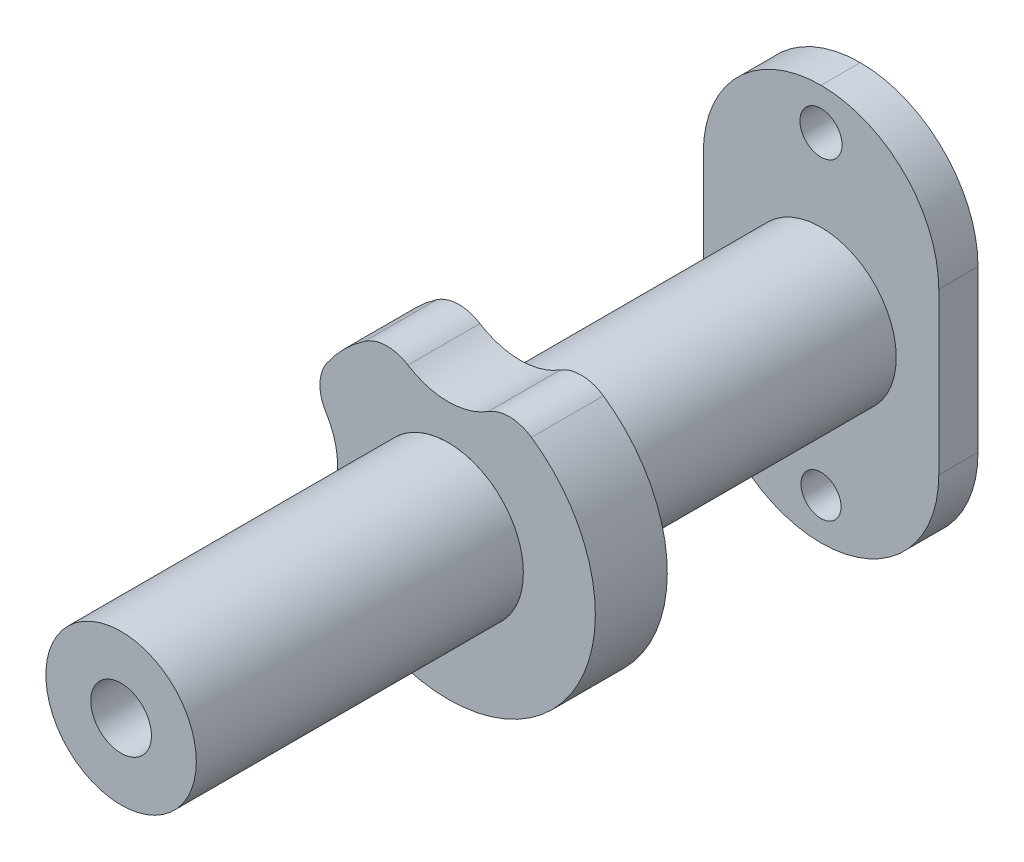
ISO-10303-21;
HEADER;
FILE_DESCRIPTION(('STEP AP214'),'2;1');
FILE_NAME('part.step','',(''),(''),'','','');
FILE_SCHEMA(('AUTOMOTIVE_DESIGN { 1 0 10303 214 1 1 1 1 }'));
ENDSEC;
DATA;
#1=APPLICATION_CONTEXT('core data for automotive mechanical design processes');
#2=APPLICATION_PROTOCOL_DEFINITION('international standard','automotive_design',2000,#1);
#3=PRODUCT_CONTEXT('',#1,'mechanical');
#4=PRODUCT('Part','Part','',(#3));
#5=PRODUCT_RELATED_PRODUCT_CATEGORY('part','',(#4));
#6=PRODUCT_DEFINITION_FORMATION('','',#4);
#7=PRODUCT_DEFINITION_CONTEXT('part definition',#1,'design');
#8=PRODUCT_DEFINITION('design','',#6,#7);
#9=PRODUCT_DEFINITION_SHAPE('','',#8);
#10=(LENGTH_UNIT() NAMED_UNIT(*) SI_UNIT(.MILLI.,.METRE.));
#11=(NAMED_UNIT(*) PLANE_ANGLE_UNIT() SI_UNIT($,.RADIAN.));
#12=(NAMED_UNIT(*) SI_UNIT($,.STERADIAN.) SOLID_ANGLE_UNIT());
#13=UNCERTAINTY_MEASURE_WITH_UNIT(LENGTH_MEASURE(1.E-05),#10,'distance_accuracy_value','');
#14=(GEOMETRIC_REPRESENTATION_CONTEXT(3) GLOBAL_UNCERTAINTY_ASSIGNED_CONTEXT((#13)) GLOBAL_UNIT_ASSIGNED_CONTEXT((#10,
#11,#12)) REPRESENTATION_CONTEXT('',''));
#15=CARTESIAN_POINT('',(0.,0.,0.));
#16=DIRECTION('',(0.,0.,1.));
#17=DIRECTION('',(1.,0.,0.));
#18=AXIS2_PLACEMENT_3D('',#15,#16,#17);
#19=CARTESIAN_POINT('',(0.,0.,43.8));
#20=DIRECTION('',(0.,0.,-1.));
#21=DIRECTION('',(-1.,0.,0.));
#22=AXIS2_PLACEMENT_3D('',#19,#20,#21);
#23=CYLINDRICAL_SURFACE('',#22,5.75);
#24=CARTESIAN_POINT('',(0.,0.,43.8));
#25=DIRECTION('',(0.,0.,1.));
#26=DIRECTION('',(1.,0.,0.));
#27=AXIS2_PLACEMENT_3D('',#24,#25,#26);
#28=CIRCLE('',#27,5.75);
#29=CARTESIAN_POINT('',(5.75,0.,43.8));
#30=VERTEX_POINT('',#29);
#31=EDGE_CURVE('E12',#30,#30,#28,.T.);
#32=ORIENTED_EDGE('',*,*,#31,.F.);
#33=EDGE_LOOP('',(#32));
#34=FACE_BOUND('',#33,.T.);
#35=CARTESIAN_POINT('',(0.,0.,18.8));
#36=DIRECTION('',(0.,0.,1.));
#37=DIRECTION('',(1.,0.,0.));
#38=AXIS2_PLACEMENT_3D('',#35,#36,#37);
#39=CIRCLE('',#38,5.75);
#40=CARTESIAN_POINT('',(5.75,0.,18.8));
#41=VERTEX_POINT('',#40);
#42=EDGE_CURVE('E63',#41,#41,#39,.T.);
#43=ORIENTED_EDGE('',*,*,#42,.T.);
#44=EDGE_LOOP('',(#43));
#45=FACE_BOUND('',#44,.T.);
#46=ADVANCED_FACE('F56',(#34,#45),#23,.T.);
#47=CARTESIAN_POINT('',(0.,0.,43.8));
#48=DIRECTION('',(0.,0.,1.));
#49=DIRECTION('',(1.,0.,0.));
#50=AXIS2_PLACEMENT_3D('',#47,#48,#49);
#51=PLANE('',#50);
#52=CARTESIAN_POINT('',(0.,0.,43.8));
#53=DIRECTION('',(0.,0.,1.));
#54=DIRECTION('',(1.,0.,0.));
#55=AXIS2_PLACEMENT_3D('',#52,#53,#54);
#56=CIRCLE('',#55,2.32);
#57=CARTESIAN_POINT('',(2.32,0.,43.8));
#58=VERTEX_POINT('',#57);
#59=EDGE_CURVE('E68',#58,#58,#56,.T.);
#60=ORIENTED_EDGE('',*,*,#59,.F.);
#61=EDGE_LOOP('',(#60));
#62=FACE_BOUND('',#61,.T.);
#63=ORIENTED_EDGE('',*,*,#31,.T.);
#64=EDGE_LOOP('',(#63));
#65=FACE_BOUND('',#64,.T.);
#66=ADVANCED_FACE('F85',(#62,#65),#51,.T.);
#67=CARTESIAN_POINT('',(0.,0.,18.8));
#68=DIRECTION('',(0.,0.,1.));
#69=DIRECTION('',(1.,0.,0.));
#70=AXIS2_PLACEMENT_3D('',#67,#68,#69);
#71=PLANE('',#70);
#72=CARTESIAN_POINT('',(0.,0.,18.8));
#73=DIRECTION('',(0.,0.,1.));
#74=DIRECTION('',(1.,0.,0.));
#75=AXIS2_PLACEMENT_3D('',#72,#73,#74);
#76=CIRCLE('',#75,2.32);
#77=CARTESIAN_POINT('',(2.32,0.,18.8));
#78=VERTEX_POINT('',#77);
#79=EDGE_CURVE('E59',#78,#78,#76,.T.);
#80=ORIENTED_EDGE('',*,*,#79,.T.);
#81=EDGE_LOOP('',(#80));
#82=FACE_BOUND('',#81,.T.);
#83=ORIENTED_EDGE('',*,*,#42,.F.);
#84=EDGE_LOOP('',(#83));
#85=FACE_BOUND('',#84,.T.);
#86=ADVANCED_FACE('F76',(#82,#85),#71,.F.);
#87=CARTESIAN_POINT('',(0.,0.,92.3));
#88=DIRECTION('',(0.,0.,-1.));
#89=DIRECTION('',(-1.,0.,0.));
#90=AXIS2_PLACEMENT_3D('',#87,#88,#89);
#91=CYLINDRICAL_SURFACE('',#90,2.32);
#92=ORIENTED_EDGE('',*,*,#59,.T.);
#93=EDGE_LOOP('',(#92));
#94=FACE_BOUND('',#93,.T.);
#95=ORIENTED_EDGE('',*,*,#79,.F.);
#96=EDGE_LOOP('',(#95));
#97=FACE_BOUND('',#96,.T.);
#98=ADVANCED_FACE('F79',(#94,#97),#91,.F.);
#99=CLOSED_SHELL('',(#46,#66,#86,#98));
#100=MANIFOLD_SOLID_BREP('B2',#99);
#101=CARTESIAN_POINT('',(0.,0.,5.5));
#102=DIRECTION('',(0.,0.,-1.));
#103=DIRECTION('',(-1.,0.,0.));
#104=AXIS2_PLACEMENT_3D('',#101,#102,#103);
#105=CYLINDRICAL_SURFACE('',#104,11.25);
#106=CARTESIAN_POINT('',(0.,0.,13.3));
#107=DIRECTION('',(0.,0.,-1.));
#108=DIRECTION('',(-1.,0.,0.));
#109=AXIS2_PLACEMENT_3D('',#106,#107,#108);
#110=CIRCLE('',#109,11.25);
#111=CARTESIAN_POINT('',(-9.27368758002561,6.3687690072791,13.3));
#112=VERTEX_POINT('',#111);
#113=CARTESIAN_POINT('',(-6.3687690072791,9.27368758002561,13.3));
#114=VERTEX_POINT('',#113);
#115=EDGE_CURVE('E341',#112,#114,#110,.T.);
#116=ORIENTED_EDGE('',*,*,#115,.F.);
#117=DIRECTION('',(0.,0.,-1.));
#118=VECTOR('',#117,1.);
#119=CARTESIAN_POINT('',(-9.27368758002561,6.3687690072791,5.5));
#120=LINE('',#119,#118);
#121=CARTESIAN_POINT('',(-9.27368758002561,6.3687690072791,18.8));
#122=VERTEX_POINT('',#121);
#123=EDGE_CURVE('E305',#112,#122,#120,.F.);
#124=ORIENTED_EDGE('',*,*,#123,.T.);
#125=CARTESIAN_POINT('',(0.,0.,18.8));
#126=DIRECTION('',(0.,0.,-1.));
#127=DIRECTION('',(-1.,0.,0.));
#128=AXIS2_PLACEMENT_3D('',#125,#126,#127);
#129=CIRCLE('',#128,11.25);
#130=CARTESIAN_POINT('',(-6.3687690072791,9.27368758002561,18.8));
#131=VERTEX_POINT('',#130);
#132=EDGE_CURVE('E333',#122,#131,#129,.T.);
#133=ORIENTED_EDGE('',*,*,#132,.T.);
#134=DIRECTION('',(0.,0.,-1.));
#135=VECTOR('',#134,1.);
#136=CARTESIAN_POINT('',(-6.3687690072791,9.27368758002561,5.5));
#137=LINE('',#136,#135);
#138=EDGE_CURVE('E303',#131,#114,#137,.T.);
#139=ORIENTED_EDGE('',*,*,#138,.T.);
#140=EDGE_LOOP('',(#116,#124,#133,#139));
#141=FACE_BOUND('',#140,.T.);
#142=ADVANCED_FACE('F117',(#141),#105,.T.);
#143=CARTESIAN_POINT('',(6.3687690072791,9.27368758002561,18.8));
#144=VERTEX_POINT('',#143);
#145=CARTESIAN_POINT('',(-9.2736875800256,-6.36876900727911,18.8));
#146=VERTEX_POINT('',#145);
#147=EDGE_CURVE('E330',#144,#146,#129,.T.);
#148=ORIENTED_EDGE('',*,*,#147,.T.);
#149=DIRECTION('',(0.,0.,-1.));
#150=VECTOR('',#149,1.);
#151=CARTESIAN_POINT('',(-9.27368758002561,-6.36876900727911,5.5));
#152=LINE('',#151,#150);
#153=CARTESIAN_POINT('',(-9.2736875800256,-6.36876900727911,13.3));
#154=VERTEX_POINT('',#153);
#155=EDGE_CURVE('E295',#146,#154,#152,.T.);
#156=ORIENTED_EDGE('',*,*,#155,.T.);
#157=CARTESIAN_POINT('',(6.3687690072791,9.27368758002561,13.3));
#158=VERTEX_POINT('',#157);
#159=EDGE_CURVE('E340',#158,#154,#110,.T.);
#160=ORIENTED_EDGE('',*,*,#159,.F.);
#161=DIRECTION('',(0.,0.,-1.));
#162=VECTOR('',#161,1.);
#163=CARTESIAN_POINT('',(6.3687690072791,9.27368758002561,5.5));
#164=LINE('',#163,#162);
#165=EDGE_CURVE('E293',#158,#144,#164,.F.);
#166=ORIENTED_EDGE('',*,*,#165,.T.);
#167=EDGE_LOOP('',(#148,#156,#160,#166));
#168=FACE_BOUND('',#167,.T.);
#169=ADVANCED_FACE('F388',(#168),#105,.T.);
#170=CARTESIAN_POINT('',(0.,0.,13.3));
#171=DIRECTION('',(0.,0.,-1.));
#172=DIRECTION('',(-1.,0.,0.));
#173=AXIS2_PLACEMENT_3D('',#170,#171,#172);
#174=PLANE('',#173);
#175=ORIENTED_EDGE('',*,*,#159,.T.);
#176=CARTESIAN_POINT('',(-6.80070422535211,-4.67043060533801,13.3));
#177=DIRECTION('',(0.,0.,-1.));
#178=DIRECTION('',(-1.,0.,0.));
#179=AXIS2_PLACEMENT_3D('',#176,#177,#178);
#180=CIRCLE('',#179,3.);
#181=CARTESIAN_POINT('',(-9.33760563380281,-3.06914011207927,13.3));
#182=VERTEX_POINT('',#181);
#183=EDGE_CURVE('E301',#154,#182,#180,.T.);
#184=ORIENTED_EDGE('',*,*,#183,.T.);
#185=CARTESIAN_POINT('',(-14.2,0.,13.3));
#186=DIRECTION('',(0.,0.,-1.));
#187=DIRECTION('',(-1.,0.,0.));
#188=AXIS2_PLACEMENT_3D('',#185,#186,#187);
#189=CIRCLE('',#188,5.75);
#190=CARTESIAN_POINT('',(-9.33760563380281,3.06914011207926,13.3));
#191=VERTEX_POINT('',#190);
#192=EDGE_CURVE('E322',#191,#182,#189,.T.);
#193=ORIENTED_EDGE('',*,*,#192,.F.);
#194=CARTESIAN_POINT('',(-6.80070422535211,4.67043060533801,13.3));
#195=DIRECTION('',(0.,0.,-1.));
#196=DIRECTION('',(-1.,0.,0.));
#197=AXIS2_PLACEMENT_3D('',#194,#195,#196);
#198=CIRCLE('',#197,3.);
#199=EDGE_CURVE('E299',#191,#112,#198,.T.);
#200=ORIENTED_EDGE('',*,*,#199,.T.);
#201=ORIENTED_EDGE('',*,*,#115,.T.);
#202=CARTESIAN_POINT('',(-4.67043060533801,6.80070422535211,13.3));
#203=DIRECTION('',(0.,0.,-1.));
#204=DIRECTION('',(-1.,0.,0.));
#205=AXIS2_PLACEMENT_3D('',#202,#203,#204);
#206=CIRCLE('',#205,3.);
#207=CARTESIAN_POINT('',(-3.06914011207926,9.33760563380281,13.3));
#208=VERTEX_POINT('',#207);
#209=EDGE_CURVE('E132',#114,#208,#206,.T.);
#210=ORIENTED_EDGE('',*,*,#209,.T.);
#211=CARTESIAN_POINT('',(0.,14.2,13.3));
#212=DIRECTION('',(0.,0.,-1.));
#213=DIRECTION('',(-1.,0.,0.));
#214=AXIS2_PLACEMENT_3D('',#211,#212,#213);
#215=CIRCLE('',#214,5.75);
#216=CARTESIAN_POINT('',(3.06914011207926,9.33760563380281,13.3));
#217=VERTEX_POINT('',#216);
#218=EDGE_CURVE('E313',#217,#208,#215,.T.);
#219=ORIENTED_EDGE('',*,*,#218,.F.);
#220=CARTESIAN_POINT('',(4.67043060533801,6.80070422535211,13.3));
#221=DIRECTION('',(0.,0.,-1.));
#222=DIRECTION('',(-1.,0.,0.));
#223=AXIS2_PLACEMENT_3D('',#220,#221,#222);
#224=CIRCLE('',#223,3.);
#225=EDGE_CURVE('E140',#217,#158,#224,.T.);
#226=ORIENTED_EDGE('',*,*,#225,.T.);
#227=EDGE_LOOP('',(#175,#184,#193,#200,#201,#210,#219,#226));
#228=FACE_BOUND('',#227,.T.);
#229=CARTESIAN_POINT('',(0.,0.,13.3));
#230=DIRECTION('',(0.,0.,-1.));
#231=DIRECTION('',(-1.,0.,0.));
#232=AXIS2_PLACEMENT_3D('',#229,#230,#231);
#233=CIRCLE('',#232,5.75);
#234=CARTESIAN_POINT('',(-5.75,0.,13.3));
#235=VERTEX_POINT('',#234);
#236=EDGE_CURVE('E337',#235,#235,#233,.T.);
#237=ORIENTED_EDGE('',*,*,#236,.F.);
#238=EDGE_LOOP('',(#237));
#239=FACE_BOUND('',#238,.T.);
#240=ADVANCED_FACE('F394',(#228,#239),#174,.T.);
#241=CARTESIAN_POINT('',(0.,0.,25.5));
#242=DIRECTION('',(0.,0.,-1.));
#243=DIRECTION('',(-1.,0.,0.));
#244=AXIS2_PLACEMENT_3D('',#241,#242,#243);
#245=CYLINDRICAL_SURFACE('',#244,2.32);
#246=CARTESIAN_POINT('',(0.,0.,-12.7));
#247=DIRECTION('',(0.,0.,-1.));
#248=DIRECTION('',(-1.,0.,0.));
#249=AXIS2_PLACEMENT_3D('',#246,#247,#248);
#250=CIRCLE('',#249,2.32);
#251=CARTESIAN_POINT('',(-2.32,0.,-12.7));
#252=VERTEX_POINT('',#251);
#253=EDGE_CURVE('E240',#252,#252,#250,.T.);
#254=ORIENTED_EDGE('',*,*,#253,.T.);
#255=EDGE_LOOP('',(#254));
#256=FACE_BOUND('',#255,.T.);
#257=CARTESIAN_POINT('',(0.,0.,18.5));
#258=DIRECTION('',(0.,0.,1.));
#259=DIRECTION('',(1.,0.,0.));
#260=AXIS2_PLACEMENT_3D('',#257,#258,#259);
#261=CIRCLE('',#260,2.32);
#262=CARTESIAN_POINT('',(2.32,0.,18.5));
#263=VERTEX_POINT('',#262);
#264=EDGE_CURVE('E343',#263,#263,#261,.T.);
#265=ORIENTED_EDGE('',*,*,#264,.T.);
#266=EDGE_LOOP('',(#265));
#267=FACE_BOUND('',#266,.T.);
#268=ADVANCED_FACE('F399',(#256,#267),#245,.F.);
#269=CARTESIAN_POINT('',(0.,0.,-12.7));
#270=DIRECTION('',(0.,0.,-1.));
#271=DIRECTION('',(-1.,0.,0.));
#272=AXIS2_PLACEMENT_3D('',#269,#270,#271);
#273=PLANE('',#272);
#274=CARTESIAN_POINT('',(0.,12.,-12.7));
#275=DIRECTION('',(0.,0.,-1.));
#276=DIRECTION('',(-1.,0.,0.));
#277=AXIS2_PLACEMENT_3D('',#274,#275,#276);
#278=CIRCLE('',#277,1.61044068265874);
#279=CARTESIAN_POINT('',(-1.61044068265874,12.,-12.7));
#280=VERTEX_POINT('',#279);
#281=EDGE_CURVE('E347',#280,#280,#278,.T.);
#282=ORIENTED_EDGE('',*,*,#281,.F.);
#283=EDGE_LOOP('',(#282));
#284=FACE_BOUND('',#283,.T.);
#285=CARTESIAN_POINT('',(0.,-12.,-12.7));
#286=DIRECTION('',(0.,0.,-1.));
#287=DIRECTION('',(-1.,0.,0.));
#288=AXIS2_PLACEMENT_3D('',#285,#286,#287);
#289=CIRCLE('',#288,1.53);
#290=CARTESIAN_POINT('',(-1.53,-12.,-12.7));
#291=VERTEX_POINT('',#290);
#292=EDGE_CURVE('E346',#291,#291,#289,.T.);
#293=ORIENTED_EDGE('',*,*,#292,.F.);
#294=EDGE_LOOP('',(#293));
#295=FACE_BOUND('',#294,.T.);
#296=ORIENTED_EDGE('',*,*,#253,.F.);
#297=EDGE_LOOP('',(#296));
#298=FACE_BOUND('',#297,.T.);
#299=DIRECTION('',(0.,-1.,0.));
#300=VECTOR('',#299,1.);
#301=CARTESIAN_POINT('',(9.,15.15,-12.7));
#302=LINE('',#301,#300);
#303=CARTESIAN_POINT('',(9.,6.15,-12.7));
#304=VERTEX_POINT('',#303);
#305=CARTESIAN_POINT('',(9.,-6.15,-12.7));
#306=VERTEX_POINT('',#305);
#307=EDGE_CURVE('E223',#304,#306,#302,.T.);
#308=ORIENTED_EDGE('',*,*,#307,.T.);
#309=CARTESIAN_POINT('',(0.,-6.15,-12.7));
#310=DIRECTION('',(0.,0.,-1.));
#311=DIRECTION('',(-1.,0.,0.));
#312=AXIS2_PLACEMENT_3D('',#309,#310,#311);
#313=CIRCLE('',#312,9.);
#314=CARTESIAN_POINT('',(0.,-15.15,-12.7));
#315=VERTEX_POINT('',#314);
#316=EDGE_CURVE('E256',#306,#315,#313,.T.);
#317=ORIENTED_EDGE('',*,*,#316,.T.);
#318=CARTESIAN_POINT('',(0.,-6.15,-12.7));
#319=DIRECTION('',(0.,0.,-1.));
#320=DIRECTION('',(-1.,0.,0.));
#321=AXIS2_PLACEMENT_3D('',#318,#319,#320);
#322=CIRCLE('',#321,9.);
#323=CARTESIAN_POINT('',(-9.,-6.15,-12.7));
#324=VERTEX_POINT('',#323);
#325=EDGE_CURVE('E254',#315,#324,#322,.T.);
#326=ORIENTED_EDGE('',*,*,#325,.T.);
#327=DIRECTION('',(0.,1.,0.));
#328=VECTOR('',#327,1.);
#329=CARTESIAN_POINT('',(-9.,15.15,-12.7));
#330=LINE('',#329,#328);
#331=CARTESIAN_POINT('',(-9.,6.15,-12.7));
#332=VERTEX_POINT('',#331);
#333=EDGE_CURVE('E239',#324,#332,#330,.T.);
#334=ORIENTED_EDGE('',*,*,#333,.T.);
#335=CARTESIAN_POINT('',(0.,6.15,-12.7));
#336=DIRECTION('',(0.,0.,-1.));
#337=DIRECTION('',(-1.,0.,0.));
#338=AXIS2_PLACEMENT_3D('',#335,#336,#337);
#339=CIRCLE('',#338,9.);
#340=CARTESIAN_POINT('',(0.,15.15,-12.7));
#341=VERTEX_POINT('',#340);
#342=EDGE_CURVE('E225',#332,#341,#339,.T.);
#343=ORIENTED_EDGE('',*,*,#342,.T.);
#344=CARTESIAN_POINT('',(0.,6.15,-12.7));
#345=DIRECTION('',(0.,0.,-1.));
#346=DIRECTION('',(-1.,0.,0.));
#347=AXIS2_PLACEMENT_3D('',#344,#345,#346);
#348=CIRCLE('',#347,9.);
#349=EDGE_CURVE('E220',#341,#304,#348,.T.);
#350=ORIENTED_EDGE('',*,*,#349,.T.);
#351=EDGE_LOOP('',(#308,#317,#326,#334,#343,#350));
#352=FACE_BOUND('',#351,.T.);
#353=ADVANCED_FACE('F222',(#284,#295,#298,#352),#273,.T.);
#354=CARTESIAN_POINT('',(-9.,15.15,-9.7));
#355=DIRECTION('',(-1.,0.,0.));
#356=DIRECTION('',(0.,-1.,0.));
#357=AXIS2_PLACEMENT_3D('',#354,#355,#356);
#358=PLANE('',#357);
#359=ORIENTED_EDGE('',*,*,#333,.F.);
#360=DIRECTION('',(0.,0.,-1.));
#361=VECTOR('',#360,1.);
#362=CARTESIAN_POINT('',(-9.,-6.15,-9.7));
#363=LINE('',#362,#361);
#364=CARTESIAN_POINT('',(-9.,-6.15,-9.7));
#365=VERTEX_POINT('',#364);
#366=EDGE_CURVE('E268',#324,#365,#363,.F.);
#367=ORIENTED_EDGE('',*,*,#366,.T.);
#368=DIRECTION('',(0.,1.,0.));
#369=VECTOR('',#368,1.);
#370=CARTESIAN_POINT('',(-9.,15.15,-9.7));
#371=LINE('',#370,#369);
#372=CARTESIAN_POINT('',(-9.,6.15,-9.7));
#373=VERTEX_POINT('',#372);
#374=EDGE_CURVE('E249',#365,#373,#371,.T.);
#375=ORIENTED_EDGE('',*,*,#374,.T.);
#376=DIRECTION('',(0.,0.,-1.));
#377=VECTOR('',#376,1.);
#378=CARTESIAN_POINT('',(-9.,6.15,-9.7));
#379=LINE('',#378,#377);
#380=EDGE_CURVE('E265',#373,#332,#379,.T.);
#381=ORIENTED_EDGE('',*,*,#380,.T.);
#382=EDGE_LOOP('',(#359,#367,#375,#381));
#383=FACE_BOUND('',#382,.T.);
#384=ADVANCED_FACE('F365',(#383),#358,.T.);
#385=CARTESIAN_POINT('',(0.,6.15,-9.7));
#386=DIRECTION('',(0.,0.,-1.));
#387=DIRECTION('',(-1.,0.,0.));
#388=AXIS2_PLACEMENT_3D('',#385,#386,#387);
#389=CYLINDRICAL_SURFACE('',#388,9.);
#390=CARTESIAN_POINT('',(0.,6.15,-9.7));
#391=DIRECTION('',(0.,0.,1.));
#392=DIRECTION('',(1.,0.,0.));
#393=AXIS2_PLACEMENT_3D('',#390,#391,#392);
#394=CIRCLE('',#393,9.);
#395=CARTESIAN_POINT('',(0.,15.15,-9.7));
#396=VERTEX_POINT('',#395);
#397=EDGE_CURVE('E259',#396,#373,#394,.T.);
#398=ORIENTED_EDGE('',*,*,#397,.F.);
#399=DIRECTION('',(0.,0.,-1.));
#400=VECTOR('',#399,1.);
#401=CARTESIAN_POINT('',(0.,15.15,-9.7));
#402=LINE('',#401,#400);
#403=EDGE_CURVE('E274',#396,#341,#402,.T.);
#404=ORIENTED_EDGE('',*,*,#403,.T.);
#405=ORIENTED_EDGE('',*,*,#342,.F.);
#406=ORIENTED_EDGE('',*,*,#380,.F.);
#407=EDGE_LOOP('',(#398,#404,#405,#406));
#408=FACE_BOUND('',#407,.T.);
#409=ADVANCED_FACE('F377',(#408),#389,.T.);
#410=CARTESIAN_POINT('',(0.,6.15,-9.7));
#411=DIRECTION('',(0.,0.,-1.));
#412=DIRECTION('',(-1.,0.,0.));
#413=AXIS2_PLACEMENT_3D('',#410,#411,#412);
#414=CYLINDRICAL_SURFACE('',#413,9.);
#415=ORIENTED_EDGE('',*,*,#403,.F.);
#416=CARTESIAN_POINT('',(0.,6.15,-9.7));
#417=DIRECTION('',(0.,0.,1.));
#418=DIRECTION('',(1.,0.,0.));
#419=AXIS2_PLACEMENT_3D('',#416,#417,#418);
#420=CIRCLE('',#419,9.);
#421=CARTESIAN_POINT('',(9.,6.15,-9.7));
#422=VERTEX_POINT('',#421);
#423=EDGE_CURVE('E244',#422,#396,#420,.T.);
#424=ORIENTED_EDGE('',*,*,#423,.F.);
#425=DIRECTION('',(0.,0.,-1.));
#426=VECTOR('',#425,1.);
#427=CARTESIAN_POINT('',(9.,6.15,-9.7));
#428=LINE('',#427,#426);
#429=EDGE_CURVE('E236',#304,#422,#428,.F.);
#430=ORIENTED_EDGE('',*,*,#429,.F.);
#431=ORIENTED_EDGE('',*,*,#349,.F.);
#432=EDGE_LOOP('',(#415,#424,#430,#431));
#433=FACE_BOUND('',#432,.T.);
#434=ADVANCED_FACE('F243',(#433),#414,.T.);
#435=CARTESIAN_POINT('',(9.,15.15,-9.7));
#436=DIRECTION('',(1.,0.,0.));
#437=DIRECTION('',(0.,1.,0.));
#438=AXIS2_PLACEMENT_3D('',#435,#436,#437);
#439=PLANE('',#438);
#440=DIRECTION('',(0.,-1.,0.));
#441=VECTOR('',#440,1.);
#442=CARTESIAN_POINT('',(9.,15.15,-9.7));
#443=LINE('',#442,#441);
#444=CARTESIAN_POINT('',(9.,-6.15,-9.7));
#445=VERTEX_POINT('',#444);
#446=EDGE_CURVE('E357',#422,#445,#443,.T.);
#447=ORIENTED_EDGE('',*,*,#446,.T.);
#448=DIRECTION('',(0.,0.,-1.));
#449=VECTOR('',#448,1.);
#450=CARTESIAN_POINT('',(9.,-6.15000000000001,-9.7));
#451=LINE('',#450,#449);
#452=EDGE_CURVE('E230',#445,#306,#451,.T.);
#453=ORIENTED_EDGE('',*,*,#452,.T.);
#454=ORIENTED_EDGE('',*,*,#307,.F.);
#455=ORIENTED_EDGE('',*,*,#429,.T.);
#456=EDGE_LOOP('',(#447,#453,#454,#455));
#457=FACE_BOUND('',#456,.T.);
#458=ADVANCED_FACE('F235',(#457),#439,.T.);
#459=CARTESIAN_POINT('',(0.,-6.15,-9.7));
#460=DIRECTION('',(0.,0.,-1.));
#461=DIRECTION('',(-1.,0.,0.));
#462=AXIS2_PLACEMENT_3D('',#459,#460,#461);
#463=CYLINDRICAL_SURFACE('',#462,9.);
#464=CARTESIAN_POINT('',(0.,-6.15,-9.7));
#465=DIRECTION('',(0.,0.,1.));
#466=DIRECTION('',(1.,0.,0.));
#467=AXIS2_PLACEMENT_3D('',#464,#465,#466);
#468=CIRCLE('',#467,9.);
#469=CARTESIAN_POINT('',(0.,-15.15,-9.7));
#470=VERTEX_POINT('',#469);
#471=EDGE_CURVE('E263',#470,#445,#468,.T.);
#472=ORIENTED_EDGE('',*,*,#471,.F.);
#473=DIRECTION('',(0.,0.,-1.));
#474=VECTOR('',#473,1.);
#475=CARTESIAN_POINT('',(0.,-15.15,-9.7));
#476=LINE('',#475,#474);
#477=EDGE_CURVE('E271',#470,#315,#476,.T.);
#478=ORIENTED_EDGE('',*,*,#477,.T.);
#479=ORIENTED_EDGE('',*,*,#316,.F.);
#480=ORIENTED_EDGE('',*,*,#452,.F.);
#481=EDGE_LOOP('',(#472,#478,#479,#480));
#482=FACE_BOUND('',#481,.T.);
#483=ADVANCED_FACE('F401',(#482),#463,.T.);
#484=CARTESIAN_POINT('',(0.,-6.15,-9.7));
#485=DIRECTION('',(0.,0.,-1.));
#486=DIRECTION('',(-1.,0.,0.));
#487=AXIS2_PLACEMENT_3D('',#484,#485,#486);
#488=CYLINDRICAL_SURFACE('',#487,9.);
#489=ORIENTED_EDGE('',*,*,#477,.F.);
#490=CARTESIAN_POINT('',(0.,-6.15,-9.7));
#491=DIRECTION('',(0.,0.,1.));
#492=DIRECTION('',(1.,0.,0.));
#493=AXIS2_PLACEMENT_3D('',#490,#491,#492);
#494=CIRCLE('',#493,9.);
#495=EDGE_CURVE('E261',#365,#470,#494,.T.);
#496=ORIENTED_EDGE('',*,*,#495,.F.);
#497=ORIENTED_EDGE('',*,*,#366,.F.);
#498=ORIENTED_EDGE('',*,*,#325,.F.);
#499=EDGE_LOOP('',(#489,#496,#497,#498));
#500=FACE_BOUND('',#499,.T.);
#501=ADVANCED_FACE('F371',(#500),#488,.T.);
#502=CARTESIAN_POINT('',(0.,-12.,-2.7));
#503=DIRECTION('',(0.,0.,-1.));
#504=DIRECTION('',(-1.,0.,0.));
#505=AXIS2_PLACEMENT_3D('',#502,#503,#504);
#506=CYLINDRICAL_SURFACE('',#505,1.53);
#507=CARTESIAN_POINT('',(0.,-12.,-9.7));
#508=DIRECTION('',(0.,0.,1.));
#509=DIRECTION('',(1.,0.,0.));
#510=AXIS2_PLACEMENT_3D('',#507,#508,#509);
#511=CIRCLE('',#510,1.53);
#512=CARTESIAN_POINT('',(1.53,-12.,-9.7));
#513=VERTEX_POINT('',#512);
#514=EDGE_CURVE('E350',#513,#513,#511,.T.);
#515=ORIENTED_EDGE('',*,*,#514,.T.);
#516=EDGE_LOOP('',(#515));
#517=FACE_BOUND('',#516,.T.);
#518=ORIENTED_EDGE('',*,*,#292,.T.);
#519=EDGE_LOOP('',(#518));
#520=FACE_BOUND('',#519,.T.);
#521=ADVANCED_FACE('F405',(#517,#520),#506,.F.);
#522=CARTESIAN_POINT('',(0.,12.,-2.7));
#523=DIRECTION('',(0.,0.,-1.));
#524=DIRECTION('',(-1.,0.,0.));
#525=AXIS2_PLACEMENT_3D('',#522,#523,#524);
#526=CYLINDRICAL_SURFACE('',#525,1.61044068265874);
#527=CARTESIAN_POINT('',(0.,12.,-9.7));
#528=DIRECTION('',(0.,0.,1.));
#529=DIRECTION('',(1.,0.,0.));
#530=AXIS2_PLACEMENT_3D('',#527,#528,#529);
#531=CIRCLE('',#530,1.61044068265874);
#532=CARTESIAN_POINT('',(1.61044068265874,12.,-9.7));
#533=VERTEX_POINT('',#532);
#534=EDGE_CURVE('E276',#533,#533,#531,.T.);
#535=ORIENTED_EDGE('',*,*,#534,.T.);
#536=EDGE_LOOP('',(#535));
#537=FACE_BOUND('',#536,.T.);
#538=ORIENTED_EDGE('',*,*,#281,.T.);
#539=EDGE_LOOP('',(#538));
#540=FACE_BOUND('',#539,.T.);
#541=ADVANCED_FACE('F409',(#537,#540),#526,.F.);
#542=CARTESIAN_POINT('',(0.,0.,-9.7));
#543=DIRECTION('',(0.,0.,1.));
#544=DIRECTION('',(1.,0.,0.));
#545=AXIS2_PLACEMENT_3D('',#542,#543,#544);
#546=PLANE('',#545);
#547=ORIENTED_EDGE('',*,*,#534,.F.);
#548=EDGE_LOOP('',(#547));
#549=FACE_BOUND('',#548,.T.);
#550=ORIENTED_EDGE('',*,*,#514,.F.);
#551=EDGE_LOOP('',(#550));
#552=FACE_BOUND('',#551,.T.);
#553=CARTESIAN_POINT('',(0.,0.,-9.7));
#554=DIRECTION('',(0.,0.,1.));
#555=DIRECTION('',(1.,0.,0.));
#556=AXIS2_PLACEMENT_3D('',#553,#554,#555);
#557=CIRCLE('',#556,5.75);
#558=CARTESIAN_POINT('',(5.75,0.,-9.7));
#559=VERTEX_POINT('',#558);
#560=EDGE_CURVE('E245',#559,#559,#557,.T.);
#561=ORIENTED_EDGE('',*,*,#560,.F.);
#562=EDGE_LOOP('',(#561));
#563=FACE_BOUND('',#562,.T.);
#564=ORIENTED_EDGE('',*,*,#495,.T.);
#565=ORIENTED_EDGE('',*,*,#471,.T.);
#566=ORIENTED_EDGE('',*,*,#446,.F.);
#567=ORIENTED_EDGE('',*,*,#423,.T.);
#568=ORIENTED_EDGE('',*,*,#397,.T.);
#569=ORIENTED_EDGE('',*,*,#374,.F.);
#570=EDGE_LOOP('',(#564,#565,#566,#567,#568,#569));
#571=FACE_BOUND('',#570,.T.);
#572=ADVANCED_FACE('F374',(#549,#552,#563,#571),#546,.T.);
#573=CARTESIAN_POINT('',(0.,0.,-12.7));
#574=DIRECTION('',(0.,0.,1.));
#575=DIRECTION('',(1.,0.,0.));
#576=AXIS2_PLACEMENT_3D('',#573,#574,#575);
#577=CYLINDRICAL_SURFACE('',#576,5.75);
#578=ORIENTED_EDGE('',*,*,#560,.T.);
#579=EDGE_LOOP('',(#578));
#580=FACE_BOUND('',#579,.T.);
#581=ORIENTED_EDGE('',*,*,#236,.T.);
#582=EDGE_LOOP('',(#581));
#583=FACE_BOUND('',#582,.T.);
#584=ADVANCED_FACE('F421',(#580,#583),#577,.T.);
#585=CARTESIAN_POINT('',(0.,0.,18.8));
#586=DIRECTION('',(0.,0.,-1.));
#587=DIRECTION('',(-1.,0.,0.));
#588=AXIS2_PLACEMENT_3D('',#585,#586,#587);
#589=PLANE('',#588);
#590=CARTESIAN_POINT('',(0.,0.,18.8));
#591=DIRECTION('',(0.,0.,-1.));
#592=DIRECTION('',(-1.,0.,0.));
#593=AXIS2_PLACEMENT_3D('',#590,#591,#592);
#594=CIRCLE('',#593,5.75);
#595=CARTESIAN_POINT('',(-5.75,0.,18.8));
#596=VERTEX_POINT('',#595);
#597=EDGE_CURVE('E327',#596,#596,#594,.T.);
#598=ORIENTED_EDGE('',*,*,#597,.T.);
#599=EDGE_LOOP('',(#598));
#600=FACE_BOUND('',#599,.T.);
#601=CARTESIAN_POINT('',(-14.2,0.,18.8));
#602=DIRECTION('',(0.,0.,-1.));
#603=DIRECTION('',(-1.,0.,0.));
#604=AXIS2_PLACEMENT_3D('',#601,#602,#603);
#605=CIRCLE('',#604,5.75);
#606=CARTESIAN_POINT('',(-9.33760563380281,3.06914011207926,18.8));
#607=VERTEX_POINT('',#606);
#608=CARTESIAN_POINT('',(-9.33760563380281,-3.06914011207927,18.8));
#609=VERTEX_POINT('',#608);
#610=EDGE_CURVE('E270',#607,#609,#605,.T.);
#611=ORIENTED_EDGE('',*,*,#610,.T.);
#612=CARTESIAN_POINT('',(-6.80070422535211,-4.67043060533801,18.8));
#613=DIRECTION('',(0.,0.,-1.));
#614=DIRECTION('',(-1.,0.,0.));
#615=AXIS2_PLACEMENT_3D('',#612,#613,#614);
#616=CIRCLE('',#615,3.);
#617=EDGE_CURVE('E291',#609,#146,#616,.F.);
#618=ORIENTED_EDGE('',*,*,#617,.T.);
#619=ORIENTED_EDGE('',*,*,#147,.F.);
#620=CARTESIAN_POINT('',(4.67043060533801,6.80070422535211,18.8));
#621=DIRECTION('',(0.,0.,-1.));
#622=DIRECTION('',(-1.,0.,0.));
#623=AXIS2_PLACEMENT_3D('',#620,#621,#622);
#624=CIRCLE('',#623,3.);
#625=CARTESIAN_POINT('',(3.06914011207926,9.33760563380281,18.8));
#626=VERTEX_POINT('',#625);
#627=EDGE_CURVE('E287',#144,#626,#624,.F.);
#628=ORIENTED_EDGE('',*,*,#627,.T.);
#629=CARTESIAN_POINT('',(0.,14.2,18.8));
#630=DIRECTION('',(0.,0.,1.));
#631=DIRECTION('',(1.,0.,0.));
#632=AXIS2_PLACEMENT_3D('',#629,#630,#631);
#633=CIRCLE('',#632,5.75);
#634=CARTESIAN_POINT('',(-3.06914011207926,9.33760563380281,18.8));
#635=VERTEX_POINT('',#634);
#636=EDGE_CURVE('E312',#635,#626,#633,.T.);
#637=ORIENTED_EDGE('',*,*,#636,.F.);
#638=CARTESIAN_POINT('',(-4.67043060533801,6.80070422535211,18.8));
#639=DIRECTION('',(0.,0.,-1.));
#640=DIRECTION('',(-1.,0.,0.));
#641=AXIS2_PLACEMENT_3D('',#638,#639,#640);
#642=CIRCLE('',#641,3.);
#643=EDGE_CURVE('E285',#635,#131,#642,.F.);
#644=ORIENTED_EDGE('',*,*,#643,.T.);
#645=ORIENTED_EDGE('',*,*,#132,.F.);
#646=CARTESIAN_POINT('',(-6.80070422535211,4.67043060533801,18.8));
#647=DIRECTION('',(0.,0.,-1.));
#648=DIRECTION('',(-1.,0.,0.));
#649=AXIS2_PLACEMENT_3D('',#646,#647,#648);
#650=CIRCLE('',#649,3.);
#651=EDGE_CURVE('E289',#122,#607,#650,.F.);
#652=ORIENTED_EDGE('',*,*,#651,.T.);
#653=EDGE_LOOP('',(#611,#618,#619,#628,#637,#644,#645,#652));
#654=FACE_BOUND('',#653,.T.);
#655=ADVANCED_FACE('F316',(#600,#654),#589,.F.);
#656=CARTESIAN_POINT('',(0.,0.,18.8));
#657=DIRECTION('',(0.,0.,-1.));
#658=DIRECTION('',(-1.,0.,0.));
#659=AXIS2_PLACEMENT_3D('',#656,#657,#658);
#660=CYLINDRICAL_SURFACE('',#659,5.75);
#661=CARTESIAN_POINT('',(0.,0.,18.5));
#662=DIRECTION('',(0.,0.,1.));
#663=DIRECTION('',(1.,0.,0.));
#664=AXIS2_PLACEMENT_3D('',#661,#662,#663);
#665=CIRCLE('',#664,5.75);
#666=CARTESIAN_POINT('',(5.75,0.,18.5));
#667=VERTEX_POINT('',#666);
#668=EDGE_CURVE('E334',#667,#667,#665,.T.);
#669=ORIENTED_EDGE('',*,*,#668,.F.);
#670=EDGE_LOOP('',(#669));
#671=FACE_BOUND('',#670,.T.);
#672=ORIENTED_EDGE('',*,*,#597,.F.);
#673=EDGE_LOOP('',(#672));
#674=FACE_BOUND('',#673,.T.);
#675=ADVANCED_FACE('F433',(#671,#674),#660,.F.);
#676=CARTESIAN_POINT('',(0.,0.,18.5));
#677=DIRECTION('',(0.,0.,1.));
#678=DIRECTION('',(1.,0.,0.));
#679=AXIS2_PLACEMENT_3D('',#676,#677,#678);
#680=PLANE('',#679);
#681=ORIENTED_EDGE('',*,*,#668,.T.);
#682=EDGE_LOOP('',(#681));
#683=FACE_BOUND('',#682,.T.);
#684=ORIENTED_EDGE('',*,*,#264,.F.);
#685=EDGE_LOOP('',(#684));
#686=FACE_BOUND('',#685,.T.);
#687=ADVANCED_FACE('F448',(#683,#686),#680,.T.);
#688=CARTESIAN_POINT('',(0.,14.2,8.8));
#689=DIRECTION('',(0.,0.,1.));
#690=DIRECTION('',(1.,0.,0.));
#691=AXIS2_PLACEMENT_3D('',#688,#689,#690);
#692=CYLINDRICAL_SURFACE('',#691,5.75);
#693=ORIENTED_EDGE('',*,*,#636,.T.);
#694=DIRECTION('',(0.,0.,1.));
#695=VECTOR('',#694,1.);
#696=CARTESIAN_POINT('',(3.06914011207926,9.33760563380281,8.8));
#697=LINE('',#696,#695);
#698=EDGE_CURVE('E54',#626,#217,#697,.F.);
#699=ORIENTED_EDGE('',*,*,#698,.T.);
#700=ORIENTED_EDGE('',*,*,#218,.T.);
#701=DIRECTION('',(0.,0.,1.));
#702=VECTOR('',#701,1.);
#703=CARTESIAN_POINT('',(-3.06914011207926,9.33760563380281,8.8));
#704=LINE('',#703,#702);
#705=EDGE_CURVE('E125',#208,#635,#704,.T.);
#706=ORIENTED_EDGE('',*,*,#705,.T.);
#707=EDGE_LOOP('',(#693,#699,#700,#706));
#708=FACE_BOUND('',#707,.T.);
#709=ADVANCED_FACE('F311',(#708),#692,.F.);
#710=CARTESIAN_POINT('',(-14.2,0.,8.8));
#711=DIRECTION('',(0.,0.,1.));
#712=DIRECTION('',(1.,0.,0.));
#713=AXIS2_PLACEMENT_3D('',#710,#711,#712);
#714=CYLINDRICAL_SURFACE('',#713,5.75);
#715=ORIENTED_EDGE('',*,*,#192,.T.);
#716=DIRECTION('',(0.,0.,1.));
#717=VECTOR('',#716,1.);
#718=CARTESIAN_POINT('',(-9.33760563380281,-3.06914011207927,8.8));
#719=LINE('',#718,#717);
#720=EDGE_CURVE('E282',#182,#609,#719,.T.);
#721=ORIENTED_EDGE('',*,*,#720,.T.);
#722=ORIENTED_EDGE('',*,*,#610,.F.);
#723=DIRECTION('',(0.,0.,1.));
#724=VECTOR('',#723,1.);
#725=CARTESIAN_POINT('',(-9.33760563380281,3.06914011207926,8.8));
#726=LINE('',#725,#724);
#727=EDGE_CURVE('E279',#607,#191,#726,.F.);
#728=ORIENTED_EDGE('',*,*,#727,.T.);
#729=EDGE_LOOP('',(#715,#721,#722,#728));
#730=FACE_BOUND('',#729,.T.);
#731=ADVANCED_FACE('F455',(#730),#714,.F.);
#732=CARTESIAN_POINT('',(-6.80070422535211,-4.67043060533801,5.5));
#733=DIRECTION('',(0.,0.,-1.));
#734=DIRECTION('',(-1.,0.,0.));
#735=AXIS2_PLACEMENT_3D('',#732,#733,#734);
#736=CYLINDRICAL_SURFACE('',#735,3.);
#737=ORIENTED_EDGE('',*,*,#183,.F.);
#738=ORIENTED_EDGE('',*,*,#155,.F.);
#739=ORIENTED_EDGE('',*,*,#617,.F.);
#740=ORIENTED_EDGE('',*,*,#720,.F.);
#741=EDGE_LOOP('',(#737,#738,#739,#740));
#742=FACE_BOUND('',#741,.T.);
#743=ADVANCED_FACE('F468',(#742),#736,.T.);
#744=CARTESIAN_POINT('',(-6.80070422535211,4.67043060533801,5.5));
#745=DIRECTION('',(0.,0.,1.));
#746=DIRECTION('',(1.,0.,0.));
#747=AXIS2_PLACEMENT_3D('',#744,#745,#746);
#748=CYLINDRICAL_SURFACE('',#747,3.);
#749=ORIENTED_EDGE('',*,*,#651,.F.);
#750=ORIENTED_EDGE('',*,*,#123,.F.);
#751=ORIENTED_EDGE('',*,*,#199,.F.);
#752=ORIENTED_EDGE('',*,*,#727,.F.);
#753=EDGE_LOOP('',(#749,#750,#751,#752));
#754=FACE_BOUND('',#753,.T.);
#755=ADVANCED_FACE('F473',(#754),#748,.T.);
#756=CARTESIAN_POINT('',(4.67043060533801,6.80070422535211,5.5));
#757=DIRECTION('',(0.,0.,1.));
#758=DIRECTION('',(1.,0.,0.));
#759=AXIS2_PLACEMENT_3D('',#756,#757,#758);
#760=CYLINDRICAL_SURFACE('',#759,3.);
#761=ORIENTED_EDGE('',*,*,#627,.F.);
#762=ORIENTED_EDGE('',*,*,#165,.F.);
#763=ORIENTED_EDGE('',*,*,#225,.F.);
#764=ORIENTED_EDGE('',*,*,#698,.F.);
#765=EDGE_LOOP('',(#761,#762,#763,#764));
#766=FACE_BOUND('',#765,.T.);
#767=ADVANCED_FACE('F483',(#766),#760,.T.);
#768=CARTESIAN_POINT('',(-4.67043060533801,6.80070422535211,5.5));
#769=DIRECTION('',(0.,0.,-1.));
#770=DIRECTION('',(-1.,0.,0.));
#771=AXIS2_PLACEMENT_3D('',#768,#769,#770);
#772=CYLINDRICAL_SURFACE('',#771,3.);
#773=ORIENTED_EDGE('',*,*,#209,.F.);
#774=ORIENTED_EDGE('',*,*,#138,.F.);
#775=ORIENTED_EDGE('',*,*,#643,.F.);
#776=ORIENTED_EDGE('',*,*,#705,.F.);
#777=EDGE_LOOP('',(#773,#774,#775,#776));
#778=FACE_BOUND('',#777,.T.);
#779=ADVANCED_FACE('F119',(#778),#772,.T.);
#780=CLOSED_SHELL('',(#142,#169,#240,#268,#353,#384,#409,#434,#458,#483,#501,#521,#541,#572,
#584,#655,#675,#687,#709,#731,#743,#755,#767,#779));
#781=MANIFOLD_SOLID_BREP('B7',#780);
#782=ADVANCED_BREP_SHAPE_REPRESENTATION('',(#18,#100,#781),#14);
#783=SHAPE_DEFINITION_REPRESENTATION(#9,#782);
ENDSEC;
END-ISO-10303-21;
